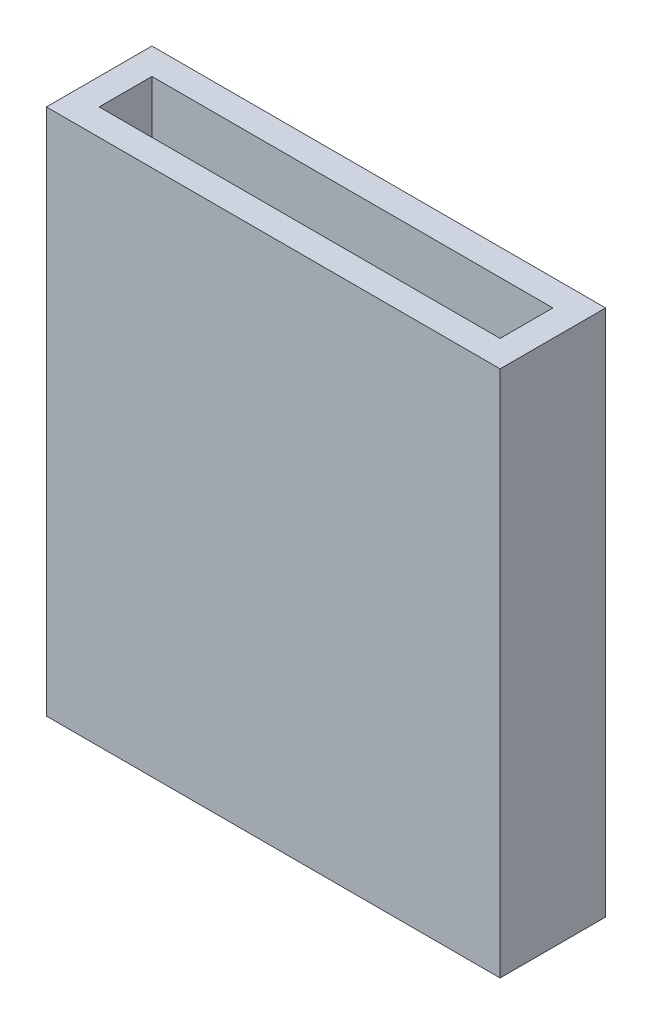
ISO-10303-21;
HEADER;
FILE_DESCRIPTION(('STEP AP214'),'2;1');
FILE_NAME('part.step','',(''),(''),'','','');
FILE_SCHEMA(('AUTOMOTIVE_DESIGN { 1 0 10303 214 1 1 1 1 }'));
ENDSEC;
DATA;
#1=APPLICATION_CONTEXT('core data for automotive mechanical design processes');
#2=APPLICATION_PROTOCOL_DEFINITION('international standard','automotive_design',2000,#1);
#3=PRODUCT_CONTEXT('',#1,'mechanical');
#4=PRODUCT('Part','Part','',(#3));
#5=PRODUCT_RELATED_PRODUCT_CATEGORY('part','',(#4));
#6=PRODUCT_DEFINITION_FORMATION('','',#4);
#7=PRODUCT_DEFINITION_CONTEXT('part definition',#1,'design');
#8=PRODUCT_DEFINITION('design','',#6,#7);
#9=PRODUCT_DEFINITION_SHAPE('','',#8);
#10=(LENGTH_UNIT() NAMED_UNIT(*) SI_UNIT(.MILLI.,.METRE.));
#11=(NAMED_UNIT(*) PLANE_ANGLE_UNIT() SI_UNIT($,.RADIAN.));
#12=(NAMED_UNIT(*) SI_UNIT($,.STERADIAN.) SOLID_ANGLE_UNIT());
#13=UNCERTAINTY_MEASURE_WITH_UNIT(LENGTH_MEASURE(1.E-05),#10,'distance_accuracy_value','');
#14=(GEOMETRIC_REPRESENTATION_CONTEXT(3) GLOBAL_UNCERTAINTY_ASSIGNED_CONTEXT((#13)) GLOBAL_UNIT_ASSIGNED_CONTEXT((#10,
#11,#12)) REPRESENTATION_CONTEXT('',''));
#15=CARTESIAN_POINT('',(0.,0.,0.));
#16=DIRECTION('',(0.,0.,1.));
#17=DIRECTION('',(1.,0.,0.));
#18=AXIS2_PLACEMENT_3D('',#15,#16,#17);
#19=CARTESIAN_POINT('',(0.,100.,20.));
#20=DIRECTION('',(1.,0.,0.));
#21=DIRECTION('',(0.,1.,0.));
#22=AXIS2_PLACEMENT_3D('',#19,#20,#21);
#23=PLANE('',#22);
#24=DIRECTION('',(0.,-1.,0.));
#25=VECTOR('',#24,1.);
#26=CARTESIAN_POINT('',(0.,100.,0.));
#27=LINE('',#26,#25);
#28=CARTESIAN_POINT('',(0.,100.,0.));
#29=VERTEX_POINT('',#28);
#30=CARTESIAN_POINT('',(0.,0.,0.));
#31=VERTEX_POINT('',#30);
#32=EDGE_CURVE('E170',#29,#31,#27,.T.);
#33=ORIENTED_EDGE('',*,*,#32,.T.);
#34=DIRECTION('',(0.,0.,-1.));
#35=VECTOR('',#34,1.);
#36=CARTESIAN_POINT('',(0.,0.,20.));
#37=LINE('',#36,#35);
#38=CARTESIAN_POINT('',(0.,0.,20.));
#39=VERTEX_POINT('',#38);
#40=EDGE_CURVE('E11',#39,#31,#37,.T.);
#41=ORIENTED_EDGE('',*,*,#40,.F.);
#42=DIRECTION('',(0.,-1.,0.));
#43=VECTOR('',#42,1.);
#44=CARTESIAN_POINT('',(0.,100.,20.));
#45=LINE('',#44,#43);
#46=CARTESIAN_POINT('',(0.,100.,20.));
#47=VERTEX_POINT('',#46);
#48=EDGE_CURVE('E175',#47,#39,#45,.T.);
#49=ORIENTED_EDGE('',*,*,#48,.F.);
#50=DIRECTION('',(0.,0.,-1.));
#51=VECTOR('',#50,1.);
#52=CARTESIAN_POINT('',(0.,100.,20.));
#53=LINE('',#52,#51);
#54=EDGE_CURVE('E181',#47,#29,#53,.T.);
#55=ORIENTED_EDGE('',*,*,#54,.T.);
#56=EDGE_LOOP('',(#33,#41,#49,#55));
#57=FACE_BOUND('',#56,.T.);
#58=ADVANCED_FACE('F44',(#57),#23,.F.);
#59=CARTESIAN_POINT('',(0.,0.,20.));
#60=DIRECTION('',(0.,1.,0.));
#61=DIRECTION('',(0.,0.,1.));
#62=AXIS2_PLACEMENT_3D('',#59,#60,#61);
#63=PLANE('',#62);
#64=CARTESIAN_POINT('',(43.,0.,10.));
#65=DIRECTION('',(0.,1.,0.));
#66=DIRECTION('',(0.,0.,1.));
#67=AXIS2_PLACEMENT_3D('',#64,#65,#66);
#68=CIRCLE('',#67,2.);
#69=CARTESIAN_POINT('',(43.,0.,12.));
#70=VERTEX_POINT('',#69);
#71=EDGE_CURVE('E48',#70,#70,#68,.T.);
#72=ORIENTED_EDGE('',*,*,#71,.T.);
#73=EDGE_LOOP('',(#72));
#74=FACE_BOUND('',#73,.T.);
#75=DIRECTION('',(1.,0.,0.));
#76=VECTOR('',#75,1.);
#77=CARTESIAN_POINT('',(0.,0.,0.));
#78=LINE('',#77,#76);
#79=CARTESIAN_POINT('',(86.,0.,0.));
#80=VERTEX_POINT('',#79);
#81=EDGE_CURVE('E186',#31,#80,#78,.T.);
#82=ORIENTED_EDGE('',*,*,#81,.T.);
#83=DIRECTION('',(0.,0.,-1.));
#84=VECTOR('',#83,1.);
#85=CARTESIAN_POINT('',(86.,0.,20.));
#86=LINE('',#85,#84);
#87=CARTESIAN_POINT('',(86.,0.,20.));
#88=VERTEX_POINT('',#87);
#89=EDGE_CURVE('E53',#88,#80,#86,.T.);
#90=ORIENTED_EDGE('',*,*,#89,.F.);
#91=DIRECTION('',(1.,0.,0.));
#92=VECTOR('',#91,1.);
#93=CARTESIAN_POINT('',(0.,0.,20.));
#94=LINE('',#93,#92);
#95=EDGE_CURVE('E98',#39,#88,#94,.T.);
#96=ORIENTED_EDGE('',*,*,#95,.F.);
#97=ORIENTED_EDGE('',*,*,#40,.T.);
#98=EDGE_LOOP('',(#82,#90,#96,#97));
#99=FACE_BOUND('',#98,.T.);
#100=ADVANCED_FACE('F223',(#74,#99),#63,.F.);
#101=CARTESIAN_POINT('',(86.,0.,20.));
#102=DIRECTION('',(-1.,0.,0.));
#103=DIRECTION('',(0.,0.,1.));
#104=AXIS2_PLACEMENT_3D('',#101,#102,#103);
#105=PLANE('',#104);
#106=DIRECTION('',(0.,1.,0.));
#107=VECTOR('',#106,1.);
#108=CARTESIAN_POINT('',(86.,0.,0.));
#109=LINE('',#108,#107);
#110=CARTESIAN_POINT('',(86.,100.,0.));
#111=VERTEX_POINT('',#110);
#112=EDGE_CURVE('E187',#80,#111,#109,.T.);
#113=ORIENTED_EDGE('',*,*,#112,.T.);
#114=DIRECTION('',(0.,0.,-1.));
#115=VECTOR('',#114,1.);
#116=CARTESIAN_POINT('',(86.,100.,20.));
#117=LINE('',#116,#115);
#118=CARTESIAN_POINT('',(86.,100.,20.));
#119=VERTEX_POINT('',#118);
#120=EDGE_CURVE('E197',#119,#111,#117,.T.);
#121=ORIENTED_EDGE('',*,*,#120,.F.);
#122=DIRECTION('',(0.,1.,0.));
#123=VECTOR('',#122,1.);
#124=CARTESIAN_POINT('',(86.,0.,20.));
#125=LINE('',#124,#123);
#126=EDGE_CURVE('E177',#88,#119,#125,.T.);
#127=ORIENTED_EDGE('',*,*,#126,.F.);
#128=ORIENTED_EDGE('',*,*,#89,.T.);
#129=EDGE_LOOP('',(#113,#121,#127,#128));
#130=FACE_BOUND('',#129,.T.);
#131=ADVANCED_FACE('F202',(#130),#105,.F.);
#132=CARTESIAN_POINT('',(86.,100.,20.));
#133=DIRECTION('',(0.,-1.,0.));
#134=DIRECTION('',(0.,0.,-1.));
#135=AXIS2_PLACEMENT_3D('',#132,#133,#134);
#136=PLANE('',#135);
#137=DIRECTION('',(0.,0.,1.));
#138=VECTOR('',#137,1.);
#139=CARTESIAN_POINT('',(4.99999999999999,100.,5.00000000000001));
#140=LINE('',#139,#138);
#141=CARTESIAN_POINT('',(5.,100.,5.00000000000001));
#142=VERTEX_POINT('',#141);
#143=CARTESIAN_POINT('',(4.99999999999999,100.,15.));
#144=VERTEX_POINT('',#143);
#145=EDGE_CURVE('E158',#142,#144,#140,.T.);
#146=ORIENTED_EDGE('',*,*,#145,.F.);
#147=DIRECTION('',(-1.,0.,0.));
#148=VECTOR('',#147,1.);
#149=CARTESIAN_POINT('',(81.,100.,5.));
#150=LINE('',#149,#148);
#151=CARTESIAN_POINT('',(81.,100.,5.));
#152=VERTEX_POINT('',#151);
#153=EDGE_CURVE('E64',#152,#142,#150,.T.);
#154=ORIENTED_EDGE('',*,*,#153,.F.);
#155=DIRECTION('',(0.,0.,-1.));
#156=VECTOR('',#155,1.);
#157=CARTESIAN_POINT('',(81.,100.,15.));
#158=LINE('',#157,#156);
#159=CARTESIAN_POINT('',(81.,100.,15.));
#160=VERTEX_POINT('',#159);
#161=EDGE_CURVE('E141',#160,#152,#158,.T.);
#162=ORIENTED_EDGE('',*,*,#161,.F.);
#163=DIRECTION('',(1.,0.,0.));
#164=VECTOR('',#163,1.);
#165=CARTESIAN_POINT('',(4.99999999999999,100.,15.));
#166=LINE('',#165,#164);
#167=EDGE_CURVE('E150',#144,#160,#166,.T.);
#168=ORIENTED_EDGE('',*,*,#167,.F.);
#169=EDGE_LOOP('',(#146,#154,#162,#168));
#170=FACE_BOUND('',#169,.T.);
#171=DIRECTION('',(-1.,0.,0.));
#172=VECTOR('',#171,1.);
#173=CARTESIAN_POINT('',(86.,100.,0.));
#174=LINE('',#173,#172);
#175=EDGE_CURVE('E93',#111,#29,#174,.T.);
#176=ORIENTED_EDGE('',*,*,#175,.T.);
#177=ORIENTED_EDGE('',*,*,#54,.F.);
#178=DIRECTION('',(-1.,0.,0.));
#179=VECTOR('',#178,1.);
#180=CARTESIAN_POINT('',(86.,100.,20.));
#181=LINE('',#180,#179);
#182=EDGE_CURVE('E69',#119,#47,#181,.T.);
#183=ORIENTED_EDGE('',*,*,#182,.F.);
#184=ORIENTED_EDGE('',*,*,#120,.T.);
#185=EDGE_LOOP('',(#176,#177,#183,#184));
#186=FACE_BOUND('',#185,.T.);
#187=ADVANCED_FACE('F213',(#170,#186),#136,.F.);
#188=CARTESIAN_POINT('',(0.,0.,20.));
#189=DIRECTION('',(0.,0.,1.));
#190=DIRECTION('',(1.,0.,0.));
#191=AXIS2_PLACEMENT_3D('',#188,#189,#190);
#192=PLANE('',#191);
#193=ORIENTED_EDGE('',*,*,#48,.T.);
#194=ORIENTED_EDGE('',*,*,#95,.T.);
#195=ORIENTED_EDGE('',*,*,#126,.T.);
#196=ORIENTED_EDGE('',*,*,#182,.T.);
#197=EDGE_LOOP('',(#193,#194,#195,#196));
#198=FACE_BOUND('',#197,.T.);
#199=ADVANCED_FACE('F214',(#198),#192,.T.);
#200=CARTESIAN_POINT('',(0.,0.,0.));
#201=DIRECTION('',(0.,0.,1.));
#202=DIRECTION('',(1.,0.,0.));
#203=AXIS2_PLACEMENT_3D('',#200,#201,#202);
#204=PLANE('',#203);
#205=ORIENTED_EDGE('',*,*,#32,.F.);
#206=ORIENTED_EDGE('',*,*,#175,.F.);
#207=ORIENTED_EDGE('',*,*,#112,.F.);
#208=ORIENTED_EDGE('',*,*,#81,.F.);
#209=EDGE_LOOP('',(#205,#206,#207,#208));
#210=FACE_BOUND('',#209,.T.);
#211=ADVANCED_FACE('F207',(#210),#204,.F.);
#212=CARTESIAN_POINT('',(81.,10.,5.));
#213=DIRECTION('',(0.,0.,-1.));
#214=DIRECTION('',(-1.,0.,0.));
#215=AXIS2_PLACEMENT_3D('',#212,#213,#214);
#216=PLANE('',#215);
#217=ORIENTED_EDGE('',*,*,#153,.T.);
#218=DIRECTION('',(0.,1.,0.));
#219=VECTOR('',#218,1.);
#220=CARTESIAN_POINT('',(4.99999999999999,10.,5.00000000000001));
#221=LINE('',#220,#219);
#222=CARTESIAN_POINT('',(4.99999999999999,10.,5.00000000000001));
#223=VERTEX_POINT('',#222);
#224=EDGE_CURVE('E120',#223,#142,#221,.T.);
#225=ORIENTED_EDGE('',*,*,#224,.F.);
#226=DIRECTION('',(-1.,0.,0.));
#227=VECTOR('',#226,1.);
#228=CARTESIAN_POINT('',(81.,10.,5.));
#229=LINE('',#228,#227);
#230=CARTESIAN_POINT('',(81.,10.,5.));
#231=VERTEX_POINT('',#230);
#232=EDGE_CURVE('E125',#231,#223,#229,.T.);
#233=ORIENTED_EDGE('',*,*,#232,.F.);
#234=DIRECTION('',(0.,1.,0.));
#235=VECTOR('',#234,1.);
#236=CARTESIAN_POINT('',(81.,10.,5.));
#237=LINE('',#236,#235);
#238=EDGE_CURVE('E163',#231,#152,#237,.T.);
#239=ORIENTED_EDGE('',*,*,#238,.T.);
#240=EDGE_LOOP('',(#217,#225,#233,#239));
#241=FACE_BOUND('',#240,.T.);
#242=ADVANCED_FACE('F117',(#241),#216,.F.);
#243=CARTESIAN_POINT('',(81.,10.,15.));
#244=DIRECTION('',(1.,0.,0.));
#245=DIRECTION('',(0.,0.,-1.));
#246=AXIS2_PLACEMENT_3D('',#243,#244,#245);
#247=PLANE('',#246);
#248=ORIENTED_EDGE('',*,*,#161,.T.);
#249=ORIENTED_EDGE('',*,*,#238,.F.);
#250=DIRECTION('',(0.,0.,-1.));
#251=VECTOR('',#250,1.);
#252=CARTESIAN_POINT('',(81.,10.,15.));
#253=LINE('',#252,#251);
#254=CARTESIAN_POINT('',(81.,10.,15.));
#255=VERTEX_POINT('',#254);
#256=EDGE_CURVE('E129',#255,#231,#253,.T.);
#257=ORIENTED_EDGE('',*,*,#256,.F.);
#258=DIRECTION('',(0.,1.,0.));
#259=VECTOR('',#258,1.);
#260=CARTESIAN_POINT('',(81.,10.,15.));
#261=LINE('',#260,#259);
#262=EDGE_CURVE('E169',#255,#160,#261,.T.);
#263=ORIENTED_EDGE('',*,*,#262,.T.);
#264=EDGE_LOOP('',(#248,#249,#257,#263));
#265=FACE_BOUND('',#264,.T.);
#266=ADVANCED_FACE('F254',(#265),#247,.F.);
#267=CARTESIAN_POINT('',(4.99999999999999,10.,15.));
#268=DIRECTION('',(0.,0.,1.));
#269=DIRECTION('',(1.,0.,0.));
#270=AXIS2_PLACEMENT_3D('',#267,#268,#269);
#271=PLANE('',#270);
#272=ORIENTED_EDGE('',*,*,#167,.T.);
#273=ORIENTED_EDGE('',*,*,#262,.F.);
#274=DIRECTION('',(1.,0.,0.));
#275=VECTOR('',#274,1.);
#276=CARTESIAN_POINT('',(4.99999999999999,10.,15.));
#277=LINE('',#276,#275);
#278=CARTESIAN_POINT('',(4.99999999999999,10.,15.));
#279=VERTEX_POINT('',#278);
#280=EDGE_CURVE('E137',#279,#255,#277,.T.);
#281=ORIENTED_EDGE('',*,*,#280,.F.);
#282=DIRECTION('',(0.,1.,0.));
#283=VECTOR('',#282,1.);
#284=CARTESIAN_POINT('',(4.99999999999999,10.,15.));
#285=LINE('',#284,#283);
#286=EDGE_CURVE('E126',#279,#144,#285,.T.);
#287=ORIENTED_EDGE('',*,*,#286,.T.);
#288=EDGE_LOOP('',(#272,#273,#281,#287));
#289=FACE_BOUND('',#288,.T.);
#290=ADVANCED_FACE('F252',(#289),#271,.F.);
#291=CARTESIAN_POINT('',(4.99999999999999,10.,5.00000000000001));
#292=DIRECTION('',(-1.,0.,0.));
#293=DIRECTION('',(0.,0.,1.));
#294=AXIS2_PLACEMENT_3D('',#291,#292,#293);
#295=PLANE('',#294);
#296=ORIENTED_EDGE('',*,*,#145,.T.);
#297=ORIENTED_EDGE('',*,*,#286,.F.);
#298=DIRECTION('',(0.,0.,1.));
#299=VECTOR('',#298,1.);
#300=CARTESIAN_POINT('',(4.99999999999999,10.,5.00000000000001));
#301=LINE('',#300,#299);
#302=EDGE_CURVE('E131',#223,#279,#301,.T.);
#303=ORIENTED_EDGE('',*,*,#302,.F.);
#304=ORIENTED_EDGE('',*,*,#224,.T.);
#305=EDGE_LOOP('',(#296,#297,#303,#304));
#306=FACE_BOUND('',#305,.T.);
#307=ADVANCED_FACE('F135',(#306),#295,.F.);
#308=CARTESIAN_POINT('',(0.,10.,0.));
#309=DIRECTION('',(0.,1.,0.));
#310=DIRECTION('',(0.,0.,1.));
#311=AXIS2_PLACEMENT_3D('',#308,#309,#310);
#312=PLANE('',#311);
#313=CARTESIAN_POINT('',(43.,10.,10.));
#314=DIRECTION('',(0.,1.,0.));
#315=DIRECTION('',(0.,0.,1.));
#316=AXIS2_PLACEMENT_3D('',#313,#314,#315);
#317=CIRCLE('',#316,2.);
#318=CARTESIAN_POINT('',(43.,9.99999999999999,12.));
#319=VERTEX_POINT('',#318);
#320=EDGE_CURVE('E147',#319,#319,#317,.T.);
#321=ORIENTED_EDGE('',*,*,#320,.F.);
#322=EDGE_LOOP('',(#321));
#323=FACE_BOUND('',#322,.T.);
#324=ORIENTED_EDGE('',*,*,#232,.T.);
#325=ORIENTED_EDGE('',*,*,#302,.T.);
#326=ORIENTED_EDGE('',*,*,#280,.T.);
#327=ORIENTED_EDGE('',*,*,#256,.T.);
#328=EDGE_LOOP('',(#324,#325,#326,#327));
#329=FACE_BOUND('',#328,.T.);
#330=ADVANCED_FACE('F139',(#323,#329),#312,.T.);
#331=CARTESIAN_POINT('',(43.,-80.,10.));
#332=DIRECTION('',(0.,1.,0.));
#333=DIRECTION('',(0.,0.,1.));
#334=AXIS2_PLACEMENT_3D('',#331,#332,#333);
#335=CYLINDRICAL_SURFACE('',#334,2.);
#336=CARTESIAN_POINT('',(43.,9.99999999999999,12.));
#337=CARTESIAN_POINT('',(43.,9.89583333333333,12.));
#338=CARTESIAN_POINT('',(43.,9.79166666666667,12.));
#339=CARTESIAN_POINT('',(43.,9.58333333333333,12.));
#340=CARTESIAN_POINT('',(43.,9.47916666666666,12.));
#341=CARTESIAN_POINT('',(43.,9.27083333333333,12.));
#342=CARTESIAN_POINT('',(43.,9.16666666666666,12.));
#343=CARTESIAN_POINT('',(43.,8.95833333333332,12.));
#344=CARTESIAN_POINT('',(43.,8.85416666666666,12.));
#345=CARTESIAN_POINT('',(43.,8.64583333333333,12.));
#346=CARTESIAN_POINT('',(43.,8.54166666666666,12.));
#347=CARTESIAN_POINT('',(43.,8.33333333333333,12.));
#348=CARTESIAN_POINT('',(43.,8.22916666666666,12.));
#349=CARTESIAN_POINT('',(43.,8.02083333333333,12.));
#350=CARTESIAN_POINT('',(43.,7.91666666666666,12.));
#351=CARTESIAN_POINT('',(43.,7.70833333333332,12.));
#352=CARTESIAN_POINT('',(43.,7.60416666666666,12.));
#353=CARTESIAN_POINT('',(43.,7.39583333333333,12.));
#354=CARTESIAN_POINT('',(43.,7.29166666666666,12.));
#355=CARTESIAN_POINT('',(43.,7.08333333333333,12.));
#356=CARTESIAN_POINT('',(43.,6.97916666666666,12.));
#357=CARTESIAN_POINT('',(43.,6.77083333333332,12.));
#358=CARTESIAN_POINT('',(43.,6.66666666666665,12.));
#359=CARTESIAN_POINT('',(43.,6.45833333333332,12.));
#360=CARTESIAN_POINT('',(43.,6.35416666666666,12.));
#361=CARTESIAN_POINT('',(43.,6.14583333333333,12.));
#362=CARTESIAN_POINT('',(43.,6.04166666666666,12.));
#363=CARTESIAN_POINT('',(43.,5.83333333333333,12.));
#364=CARTESIAN_POINT('',(43.,5.72916666666666,12.));
#365=CARTESIAN_POINT('',(43.,5.52083333333332,12.));
#366=CARTESIAN_POINT('',(43.,5.41666666666665,12.));
#367=CARTESIAN_POINT('',(43.,5.20833333333332,12.));
#368=CARTESIAN_POINT('',(43.,5.10416666666666,12.));
#369=CARTESIAN_POINT('',(43.,4.89583333333333,12.));
#370=CARTESIAN_POINT('',(43.,4.79166666666666,12.));
#371=CARTESIAN_POINT('',(43.,4.58333333333333,12.));
#372=CARTESIAN_POINT('',(43.,4.47916666666666,12.));
#373=CARTESIAN_POINT('',(43.,4.27083333333332,12.));
#374=CARTESIAN_POINT('',(43.,4.16666666666665,12.));
#375=CARTESIAN_POINT('',(43.,3.95833333333332,12.));
#376=CARTESIAN_POINT('',(43.,3.85416666666665,12.));
#377=CARTESIAN_POINT('',(43.,3.64583333333333,12.));
#378=CARTESIAN_POINT('',(43.,3.54166666666666,12.));
#379=CARTESIAN_POINT('',(43.,3.33333333333333,12.));
#380=CARTESIAN_POINT('',(43.,3.22916666666666,12.));
#381=CARTESIAN_POINT('',(43.,3.02083333333332,12.));
#382=CARTESIAN_POINT('',(43.,2.91666666666665,12.));
#383=CARTESIAN_POINT('',(43.,2.70833333333332,12.));
#384=CARTESIAN_POINT('',(43.,2.60416666666665,12.));
#385=CARTESIAN_POINT('',(43.,2.39583333333332,12.));
#386=CARTESIAN_POINT('',(43.,2.29166666666666,12.));
#387=CARTESIAN_POINT('',(43.,2.08333333333333,12.));
#388=CARTESIAN_POINT('',(43.,1.97916666666666,12.));
#389=CARTESIAN_POINT('',(43.,1.77083333333332,12.));
#390=CARTESIAN_POINT('',(43.,1.66666666666665,12.));
#391=CARTESIAN_POINT('',(43.,1.45833333333332,12.));
#392=CARTESIAN_POINT('',(43.,1.35416666666665,12.));
#393=CARTESIAN_POINT('',(43.,1.14583333333332,12.));
#394=CARTESIAN_POINT('',(43.,1.04166666666666,12.));
#395=CARTESIAN_POINT('',(43.,0.833333333333325,12.));
#396=CARTESIAN_POINT('',(43.,0.729166666666656,12.));
#397=CARTESIAN_POINT('',(43.,0.520833333333318,12.));
#398=CARTESIAN_POINT('',(43.,0.416666666666649,12.));
#399=CARTESIAN_POINT('',(43.,0.208333333333315,12.));
#400=CARTESIAN_POINT('',(43.,0.10416666666665,12.));
#401=CARTESIAN_POINT('',(43.,0.,12.));
#402=B_SPLINE_CURVE_WITH_KNOTS('',3,(#336,#337,#338,#339,#340,#341,#342,#343,#344,#345,#346,
#347,#348,#349,#350,#351,#352,#353,#354,#355,#356,#357,#358,#359,#360,#361,#362,#363,#364,#365,
#366,#367,#368,#369,#370,#371,#372,#373,#374,#375,#376,#377,#378,#379,#380,#381,#382,#383,#384,
#385,#386,#387,#388,#389,#390,#391,#392,#393,#394,#395,#396,#397,#398,#399,#400,#401),
.UNSPECIFIED.,.F.,.F.,(4,2,2,2,2,2,2,2,2,2,2,2,2,2,2,2,2,2,2,2,2,2,2,2,2,2,2,2,2,2,2,2,4),(0.,
0.312499999999993,0.625000000000001,0.937500000000008,1.25,1.56249999999999,1.875,
2.18750000000001,2.5,2.8125,3.125,3.43750000000001,3.75,4.0625,4.375,4.68750000000001,5.,5.3125,
5.62500000000001,5.93750000000001,6.25000000000001,6.5625,6.87500000000001,7.18750000000001,
7.50000000000001,7.8125,8.12500000000001,8.43750000000001,8.75000000000001,9.0625,
9.37500000000001,9.68750000000002,10.),.UNSPECIFIED.);
#403=EDGE_CURVE('BSEAM242',#319,#70,#402,.T.);
#404=ORIENTED_EDGE('',*,*,#320,.T.);
#405=ORIENTED_EDGE('',*,*,#71,.F.);
#406=ORIENTED_EDGE('',*,*,#403,.T.);
#407=ORIENTED_EDGE('',*,*,#403,.F.);
#408=EDGE_LOOP('',(#404,#406,#405,#407));
#409=FACE_BOUND('',#408,.T.);
#410=ADVANCED_FACE('F242',(#409),#335,.F.);
#411=CLOSED_SHELL('',(#58,#100,#131,#187,#199,#211,#242,#266,#290,#307,#330,#410));
#412=MANIFOLD_SOLID_BREP('B2',#411);
#413=ADVANCED_BREP_SHAPE_REPRESENTATION('',(#18,#412),#14);
#414=SHAPE_DEFINITION_REPRESENTATION(#9,#413);
ENDSEC;
END-ISO-10303-21;
